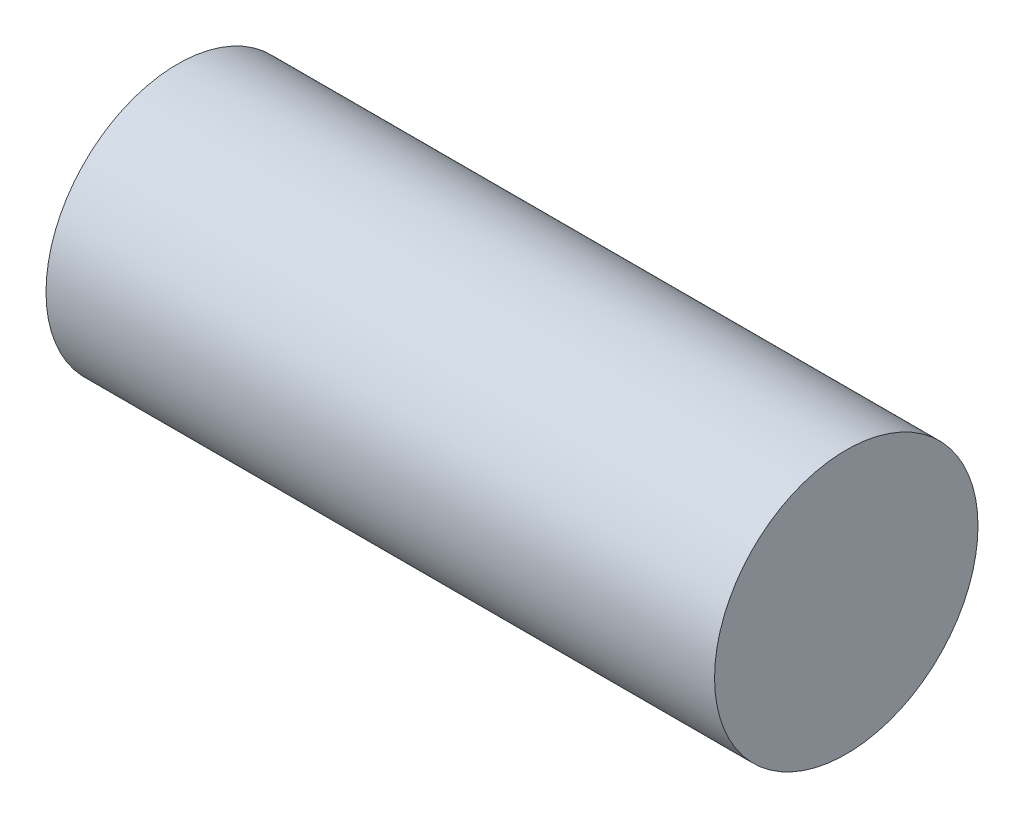
ISO-10303-21;
HEADER;
FILE_DESCRIPTION(('STEP AP214'),'2;1');
FILE_NAME('part.step','',(''),(''),'','','');
FILE_SCHEMA(('AUTOMOTIVE_DESIGN { 1 0 10303 214 1 1 1 1 }'));
ENDSEC;
DATA;
#1=APPLICATION_CONTEXT('core data for automotive mechanical design processes');
#2=APPLICATION_PROTOCOL_DEFINITION('international standard','automotive_design',2000,#1);
#3=PRODUCT_CONTEXT('',#1,'mechanical');
#4=PRODUCT('Part','Part','',(#3));
#5=PRODUCT_RELATED_PRODUCT_CATEGORY('part','',(#4));
#6=PRODUCT_DEFINITION_FORMATION('','',#4);
#7=PRODUCT_DEFINITION_CONTEXT('part definition',#1,'design');
#8=PRODUCT_DEFINITION('design','',#6,#7);
#9=PRODUCT_DEFINITION_SHAPE('','',#8);
#10=(LENGTH_UNIT() NAMED_UNIT(*) SI_UNIT(.MILLI.,.METRE.));
#11=(NAMED_UNIT(*) PLANE_ANGLE_UNIT() SI_UNIT($,.RADIAN.));
#12=(NAMED_UNIT(*) SI_UNIT($,.STERADIAN.) SOLID_ANGLE_UNIT());
#13=UNCERTAINTY_MEASURE_WITH_UNIT(LENGTH_MEASURE(1.E-05),#10,'distance_accuracy_value','');
#14=(GEOMETRIC_REPRESENTATION_CONTEXT(3) GLOBAL_UNCERTAINTY_ASSIGNED_CONTEXT((#13)) GLOBAL_UNIT_ASSIGNED_CONTEXT((#10,
#11,#12)) REPRESENTATION_CONTEXT('',''));
#15=CARTESIAN_POINT('',(0.,0.,0.));
#16=DIRECTION('',(0.,0.,1.));
#17=DIRECTION('',(1.,0.,0.));
#18=AXIS2_PLACEMENT_3D('',#15,#16,#17);
#19=CARTESIAN_POINT('',(-52.39512,35.14725,-364.15091));
#20=DIRECTION('',(1.,0.,0.));
#21=DIRECTION('',(0.,0.,-1.));
#22=AXIS2_PLACEMENT_3D('',#19,#20,#21);
#23=CYLINDRICAL_SURFACE('',#22,10.322814);
#24=CARTESIAN_POINT('',(-52.39512,35.14725,-364.15091));
#25=DIRECTION('',(1.,0.,0.));
#26=DIRECTION('',(0.,0.,-1.));
#27=AXIS2_PLACEMENT_3D('',#24,#25,#26);
#28=CIRCLE('',#27,10.322814);
#29=CARTESIAN_POINT('',(-52.39512,35.14725,-374.473724));
#30=VERTEX_POINT('',#29);
#31=EDGE_CURVE('E10',#30,#30,#28,.T.);
#32=ORIENTED_EDGE('',*,*,#31,.T.);
#33=EDGE_LOOP('',(#32));
#34=FACE_BOUND('',#33,.T.);
#35=CARTESIAN_POINT('',(0.,35.14725,-364.15091));
#36=DIRECTION('',(1.,0.,0.));
#37=DIRECTION('',(0.,0.,-1.));
#38=AXIS2_PLACEMENT_3D('',#35,#36,#37);
#39=CIRCLE('',#38,10.322814);
#40=CARTESIAN_POINT('',(0.,35.14725,-374.473724));
#41=VERTEX_POINT('',#40);
#42=EDGE_CURVE('E34',#41,#41,#39,.T.);
#43=ORIENTED_EDGE('',*,*,#42,.F.);
#44=EDGE_LOOP('',(#43));
#45=FACE_BOUND('',#44,.T.);
#46=ADVANCED_FACE('F31',(#34,#45),#23,.T.);
#47=CARTESIAN_POINT('',(-52.39512,35.14725,-364.15091));
#48=DIRECTION('',(1.,0.,0.));
#49=DIRECTION('',(0.,0.,-1.));
#50=AXIS2_PLACEMENT_3D('',#47,#48,#49);
#51=PLANE('',#50);
#52=ORIENTED_EDGE('',*,*,#31,.F.);
#53=EDGE_LOOP('',(#52));
#54=FACE_BOUND('',#53,.T.);
#55=ADVANCED_FACE('F46',(#54),#51,.F.);
#56=CARTESIAN_POINT('',(0.,35.14725,-364.15091));
#57=DIRECTION('',(1.,0.,0.));
#58=DIRECTION('',(0.,0.,-1.));
#59=AXIS2_PLACEMENT_3D('',#56,#57,#58);
#60=PLANE('',#59);
#61=ORIENTED_EDGE('',*,*,#42,.T.);
#62=EDGE_LOOP('',(#61));
#63=FACE_BOUND('',#62,.T.);
#64=ADVANCED_FACE('F43',(#63),#60,.T.);
#65=CLOSED_SHELL('',(#46,#55,#64));
#66=MANIFOLD_SOLID_BREP('B2',#65);
#67=ADVANCED_BREP_SHAPE_REPRESENTATION('',(#18,#66),#14);
#68=SHAPE_DEFINITION_REPRESENTATION(#9,#67);
ENDSEC;
END-ISO-10303-21;
